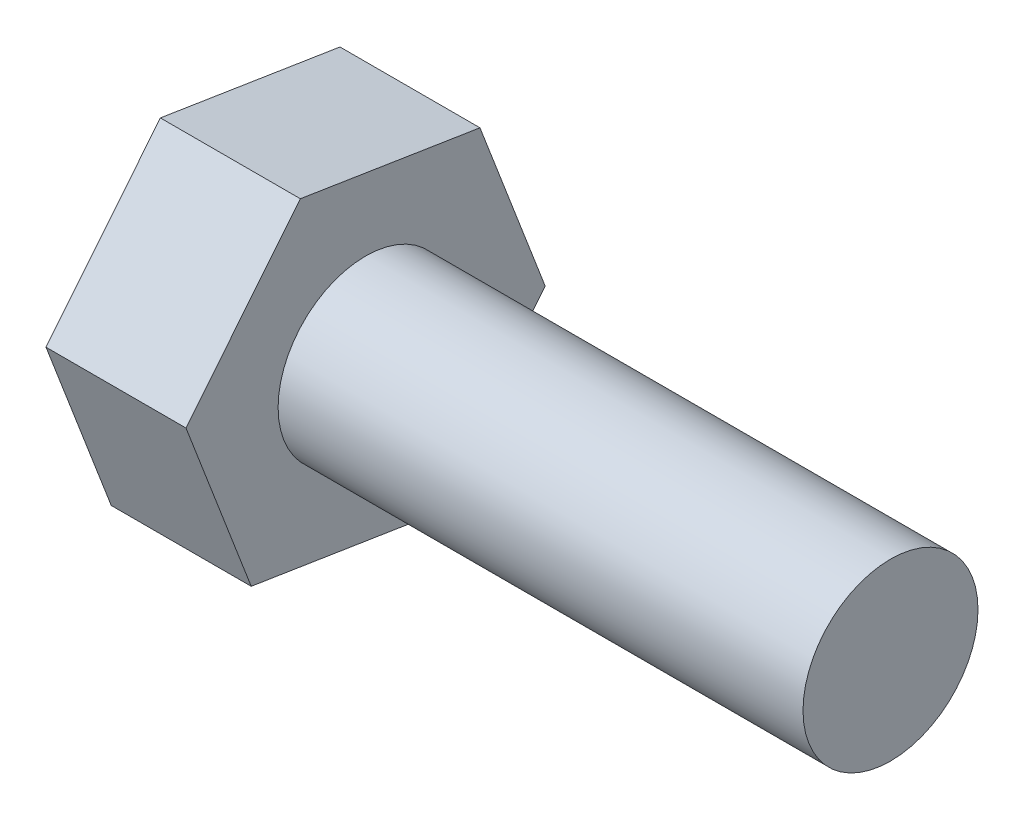
ISO-10303-21;
HEADER;
FILE_DESCRIPTION(('STEP AP214'),'2;1');
FILE_NAME('part.step','',(''),(''),'','','');
FILE_SCHEMA(('AUTOMOTIVE_DESIGN { 1 0 10303 214 1 1 1 1 }'));
ENDSEC;
DATA;
#1=APPLICATION_CONTEXT('core data for automotive mechanical design processes');
#2=APPLICATION_PROTOCOL_DEFINITION('international standard','automotive_design',2000,#1);
#3=PRODUCT_CONTEXT('',#1,'mechanical');
#4=PRODUCT('Part','Part','',(#3));
#5=PRODUCT_RELATED_PRODUCT_CATEGORY('part','',(#4));
#6=PRODUCT_DEFINITION_FORMATION('','',#4);
#7=PRODUCT_DEFINITION_CONTEXT('part definition',#1,'design');
#8=PRODUCT_DEFINITION('design','',#6,#7);
#9=PRODUCT_DEFINITION_SHAPE('','',#8);
#10=(LENGTH_UNIT() NAMED_UNIT(*) SI_UNIT(.MILLI.,.METRE.));
#11=(NAMED_UNIT(*) PLANE_ANGLE_UNIT() SI_UNIT($,.RADIAN.));
#12=(NAMED_UNIT(*) SI_UNIT($,.STERADIAN.) SOLID_ANGLE_UNIT());
#13=UNCERTAINTY_MEASURE_WITH_UNIT(LENGTH_MEASURE(1.E-05),#10,'distance_accuracy_value','');
#14=(GEOMETRIC_REPRESENTATION_CONTEXT(3) GLOBAL_UNCERTAINTY_ASSIGNED_CONTEXT((#13)) GLOBAL_UNIT_ASSIGNED_CONTEXT((#10,
#11,#12)) REPRESENTATION_CONTEXT('',''));
#15=CARTESIAN_POINT('',(0.,0.,0.));
#16=DIRECTION('',(0.,0.,1.));
#17=DIRECTION('',(1.,0.,0.));
#18=AXIS2_PLACEMENT_3D('',#15,#16,#17);
#19=CARTESIAN_POINT('',(30.,0.,0.));
#20=DIRECTION('',(-1.,0.,0.));
#21=DIRECTION('',(0.,0.,1.));
#22=AXIS2_PLACEMENT_3D('',#19,#20,#21);
#23=CYLINDRICAL_SURFACE('',#22,5.);
#24=CARTESIAN_POINT('',(30.,0.,0.));
#25=DIRECTION('',(1.,0.,0.));
#26=DIRECTION('',(0.,0.,-1.));
#27=AXIS2_PLACEMENT_3D('',#24,#25,#26);
#28=CIRCLE('',#27,5.);
#29=CARTESIAN_POINT('',(30.,0.,-5.));
#30=VERTEX_POINT('',#29);
#31=EDGE_CURVE('E11',#30,#30,#28,.T.);
#32=ORIENTED_EDGE('',*,*,#31,.F.);
#33=EDGE_LOOP('',(#32));
#34=FACE_BOUND('',#33,.T.);
#35=CARTESIAN_POINT('',(0.,0.,0.));
#36=DIRECTION('',(-1.,0.,0.));
#37=DIRECTION('',(0.,0.,1.));
#38=AXIS2_PLACEMENT_3D('',#35,#36,#37);
#39=CIRCLE('',#38,5.);
#40=CARTESIAN_POINT('',(0.,0.,5.));
#41=VERTEX_POINT('',#40);
#42=EDGE_CURVE('E40',#41,#41,#39,.T.);
#43=ORIENTED_EDGE('',*,*,#42,.F.);
#44=EDGE_LOOP('',(#43));
#45=FACE_BOUND('',#44,.T.);
#46=ADVANCED_FACE('F32',(#34,#45),#23,.T.);
#47=CARTESIAN_POINT('',(30.,0.,0.));
#48=DIRECTION('',(1.,0.,0.));
#49=DIRECTION('',(0.,0.,-1.));
#50=AXIS2_PLACEMENT_3D('',#47,#48,#49);
#51=PLANE('',#50);
#52=ORIENTED_EDGE('',*,*,#31,.T.);
#53=EDGE_LOOP('',(#52));
#54=FACE_BOUND('',#53,.T.);
#55=ADVANCED_FACE('F141',(#54),#51,.T.);
#56=CARTESIAN_POINT('',(0.,1.62068495230945,10.2651536902941));
#57=DIRECTION('',(-1.,0.,0.));
#58=DIRECTION('',(0.,0.,1.));
#59=AXIS2_PLACEMENT_3D('',#56,#57,#58);
#60=PLANE('',#59);
#61=DIRECTION('',(0.,0.933404715315125,0.358825357837891));
#62=VECTOR('',#61,1.);
#63=CARTESIAN_POINT('',(0.,-8.07954139339151,6.53613118537819));
#64=LINE('',#63,#62);
#65=CARTESIAN_POINT('',(0.,-8.07954139339151,6.53613118537819));
#66=VERTEX_POINT('',#65);
#67=CARTESIAN_POINT('',(0.,1.62068495230945,10.2651536902941));
#68=VERTEX_POINT('',#67);
#69=EDGE_CURVE('E117',#66,#68,#64,.T.);
#70=ORIENTED_EDGE('',*,*,#69,.F.);
#71=DIRECTION('',(0.,0.155950482247906,0.987764874394026));
#72=VECTOR('',#71,1.);
#73=CARTESIAN_POINT('',(0.,-9.70022634570096,-3.72902250491587));
#74=LINE('',#73,#72);
#75=CARTESIAN_POINT('',(0.,-9.70022634570096,-3.72902250491587));
#76=VERTEX_POINT('',#75);
#77=EDGE_CURVE('E77',#76,#66,#74,.T.);
#78=ORIENTED_EDGE('',*,*,#77,.F.);
#79=DIRECTION('',(0.,-0.777454233067218,0.628939516556134));
#80=VECTOR('',#79,1.);
#81=CARTESIAN_POINT('',(0.,-1.62068495230945,-10.2651536902941));
#82=LINE('',#81,#80);
#83=CARTESIAN_POINT('',(0.,-1.62068495230945,-10.2651536902941));
#84=VERTEX_POINT('',#83);
#85=EDGE_CURVE('E71',#84,#76,#82,.T.);
#86=ORIENTED_EDGE('',*,*,#85,.F.);
#87=DIRECTION('',(0.,-0.933404715315125,-0.358825357837892));
#88=VECTOR('',#87,1.);
#89=CARTESIAN_POINT('',(0.,8.07954139339151,-6.53613118537818));
#90=LINE('',#89,#88);
#91=CARTESIAN_POINT('',(0.,8.07954139339151,-6.53613118537818));
#92=VERTEX_POINT('',#91);
#93=EDGE_CURVE('E107',#92,#84,#90,.T.);
#94=ORIENTED_EDGE('',*,*,#93,.F.);
#95=DIRECTION('',(0.,-0.155950482247906,-0.987764874394026));
#96=VECTOR('',#95,1.);
#97=CARTESIAN_POINT('',(0.,9.70022634570096,3.72902250491587));
#98=LINE('',#97,#96);
#99=CARTESIAN_POINT('',(0.,9.70022634570096,3.72902250491587));
#100=VERTEX_POINT('',#99);
#101=EDGE_CURVE('E122',#100,#92,#98,.T.);
#102=ORIENTED_EDGE('',*,*,#101,.F.);
#103=DIRECTION('',(0.,0.777454233067218,-0.628939516556134));
#104=VECTOR('',#103,1.);
#105=CARTESIAN_POINT('',(0.,1.62068495230945,10.2651536902941));
#106=LINE('',#105,#104);
#107=EDGE_CURVE('E120',#68,#100,#106,.T.);
#108=ORIENTED_EDGE('',*,*,#107,.F.);
#109=EDGE_LOOP('',(#70,#78,#86,#94,#102,#108));
#110=FACE_BOUND('',#109,.T.);
#111=ORIENTED_EDGE('',*,*,#42,.T.);
#112=EDGE_LOOP('',(#111));
#113=FACE_BOUND('',#112,.T.);
#114=ADVANCED_FACE('F138',(#110,#113),#60,.F.);
#115=CARTESIAN_POINT('',(-8.,-8.07954139339151,6.53613118537819));
#116=DIRECTION('',(0.,0.358825357837891,-0.933404715315125));
#117=DIRECTION('',(0.,0.933404715315125,0.358825357837892));
#118=AXIS2_PLACEMENT_3D('',#115,#116,#117);
#119=PLANE('',#118);
#120=ORIENTED_EDGE('',*,*,#69,.T.);
#121=DIRECTION('',(1.,0.,0.));
#122=VECTOR('',#121,1.);
#123=CARTESIAN_POINT('',(-8.,1.62068495230945,10.2651536902941));
#124=LINE('',#123,#122);
#125=CARTESIAN_POINT('',(-8.,1.62068495230945,10.2651536902941));
#126=VERTEX_POINT('',#125);
#127=EDGE_CURVE('E134',#126,#68,#124,.T.);
#128=ORIENTED_EDGE('',*,*,#127,.F.);
#129=DIRECTION('',(0.,0.933404715315125,0.358825357837891));
#130=VECTOR('',#129,1.);
#131=CARTESIAN_POINT('',(-8.,-8.07954139339151,6.53613118537819));
#132=LINE('',#131,#130);
#133=CARTESIAN_POINT('',(-8.,-8.07954139339151,6.53613118537819));
#134=VERTEX_POINT('',#133);
#135=EDGE_CURVE('E127',#134,#126,#132,.T.);
#136=ORIENTED_EDGE('',*,*,#135,.F.);
#137=DIRECTION('',(1.,0.,0.));
#138=VECTOR('',#137,1.);
#139=CARTESIAN_POINT('',(-8.,-8.07954139339151,6.53613118537819));
#140=LINE('',#139,#138);
#141=EDGE_CURVE('E113',#134,#66,#140,.T.);
#142=ORIENTED_EDGE('',*,*,#141,.T.);
#143=EDGE_LOOP('',(#120,#128,#136,#142));
#144=FACE_BOUND('',#143,.T.);
#145=ADVANCED_FACE('F151',(#144),#119,.F.);
#146=CARTESIAN_POINT('',(-8.,1.62068495230945,10.2651536902941));
#147=DIRECTION('',(0.,-0.628939516556134,-0.777454233067219));
#148=DIRECTION('',(0.,0.777454233067219,-0.628939516556134));
#149=AXIS2_PLACEMENT_3D('',#146,#147,#148);
#150=PLANE('',#149);
#151=ORIENTED_EDGE('',*,*,#107,.T.);
#152=DIRECTION('',(1.,0.,0.));
#153=VECTOR('',#152,1.);
#154=CARTESIAN_POINT('',(-8.,9.70022634570096,3.72902250491587));
#155=LINE('',#154,#153);
#156=CARTESIAN_POINT('',(-8.,9.70022634570096,3.72902250491587));
#157=VERTEX_POINT('',#156);
#158=EDGE_CURVE('E131',#157,#100,#155,.T.);
#159=ORIENTED_EDGE('',*,*,#158,.F.);
#160=DIRECTION('',(0.,0.777454233067218,-0.628939516556134));
#161=VECTOR('',#160,1.);
#162=CARTESIAN_POINT('',(-8.,1.62068495230945,10.2651536902941));
#163=LINE('',#162,#161);
#164=EDGE_CURVE('E86',#126,#157,#163,.T.);
#165=ORIENTED_EDGE('',*,*,#164,.F.);
#166=ORIENTED_EDGE('',*,*,#127,.T.);
#167=EDGE_LOOP('',(#151,#159,#165,#166));
#168=FACE_BOUND('',#167,.T.);
#169=ADVANCED_FACE('F157',(#168),#150,.F.);
#170=CARTESIAN_POINT('',(-8.,9.70022634570096,3.72902250491587));
#171=DIRECTION('',(0.,-0.987764874394026,0.155950482247906));
#172=DIRECTION('',(0.,-0.155950482247906,-0.987764874394026));
#173=AXIS2_PLACEMENT_3D('',#170,#171,#172);
#174=PLANE('',#173);
#175=ORIENTED_EDGE('',*,*,#101,.T.);
#176=DIRECTION('',(1.,0.,0.));
#177=VECTOR('',#176,1.);
#178=CARTESIAN_POINT('',(-8.,8.07954139339151,-6.53613118537818));
#179=LINE('',#178,#177);
#180=CARTESIAN_POINT('',(-8.,8.07954139339151,-6.53613118537818));
#181=VERTEX_POINT('',#180);
#182=EDGE_CURVE('E108',#181,#92,#179,.T.);
#183=ORIENTED_EDGE('',*,*,#182,.F.);
#184=DIRECTION('',(0.,-0.155950482247906,-0.987764874394026));
#185=VECTOR('',#184,1.);
#186=CARTESIAN_POINT('',(-8.,9.70022634570096,3.72902250491587));
#187=LINE('',#186,#185);
#188=EDGE_CURVE('E99',#157,#181,#187,.T.);
#189=ORIENTED_EDGE('',*,*,#188,.F.);
#190=ORIENTED_EDGE('',*,*,#158,.T.);
#191=EDGE_LOOP('',(#175,#183,#189,#190));
#192=FACE_BOUND('',#191,.T.);
#193=ADVANCED_FACE('F161',(#192),#174,.F.);
#194=CARTESIAN_POINT('',(-8.,8.07954139339151,-6.53613118537818));
#195=DIRECTION('',(0.,-0.358825357837892,0.933404715315125));
#196=DIRECTION('',(0.,-0.933404715315125,-0.358825357837892));
#197=AXIS2_PLACEMENT_3D('',#194,#195,#196);
#198=PLANE('',#197);
#199=ORIENTED_EDGE('',*,*,#93,.T.);
#200=DIRECTION('',(1.,0.,0.));
#201=VECTOR('',#200,1.);
#202=CARTESIAN_POINT('',(-8.,-1.62068495230945,-10.2651536902941));
#203=LINE('',#202,#201);
#204=CARTESIAN_POINT('',(-8.,-1.62068495230945,-10.2651536902941));
#205=VERTEX_POINT('',#204);
#206=EDGE_CURVE('E104',#205,#84,#203,.T.);
#207=ORIENTED_EDGE('',*,*,#206,.F.);
#208=DIRECTION('',(0.,-0.933404715315125,-0.358825357837892));
#209=VECTOR('',#208,1.);
#210=CARTESIAN_POINT('',(-8.,8.07954139339151,-6.53613118537818));
#211=LINE('',#210,#209);
#212=EDGE_CURVE('E93',#181,#205,#211,.T.);
#213=ORIENTED_EDGE('',*,*,#212,.F.);
#214=ORIENTED_EDGE('',*,*,#182,.T.);
#215=EDGE_LOOP('',(#199,#207,#213,#214));
#216=FACE_BOUND('',#215,.T.);
#217=ADVANCED_FACE('F105',(#216),#198,.F.);
#218=CARTESIAN_POINT('',(-8.,-1.62068495230945,-10.2651536902941));
#219=DIRECTION('',(0.,0.628939516556134,0.777454233067218));
#220=DIRECTION('',(0.,-0.777454233067218,0.628939516556134));
#221=AXIS2_PLACEMENT_3D('',#218,#219,#220);
#222=PLANE('',#221);
#223=ORIENTED_EDGE('',*,*,#85,.T.);
#224=DIRECTION('',(1.,0.,0.));
#225=VECTOR('',#224,1.);
#226=CARTESIAN_POINT('',(-8.,-9.70022634570096,-3.72902250491587));
#227=LINE('',#226,#225);
#228=CARTESIAN_POINT('',(-8.,-9.70022634570096,-3.72902250491587));
#229=VERTEX_POINT('',#228);
#230=EDGE_CURVE('E109',#229,#76,#227,.T.);
#231=ORIENTED_EDGE('',*,*,#230,.F.);
#232=DIRECTION('',(0.,-0.777454233067218,0.628939516556134));
#233=VECTOR('',#232,1.);
#234=CARTESIAN_POINT('',(-8.,-1.62068495230945,-10.2651536902941));
#235=LINE('',#234,#233);
#236=EDGE_CURVE('E97',#205,#229,#235,.T.);
#237=ORIENTED_EDGE('',*,*,#236,.F.);
#238=ORIENTED_EDGE('',*,*,#206,.T.);
#239=EDGE_LOOP('',(#223,#231,#237,#238));
#240=FACE_BOUND('',#239,.T.);
#241=ADVANCED_FACE('F111',(#240),#222,.F.);
#242=CARTESIAN_POINT('',(-8.,-9.70022634570096,-3.72902250491587));
#243=DIRECTION('',(0.,0.987764874394026,-0.155950482247906));
#244=DIRECTION('',(0.,0.155950482247906,0.987764874394026));
#245=AXIS2_PLACEMENT_3D('',#242,#243,#244);
#246=PLANE('',#245);
#247=ORIENTED_EDGE('',*,*,#77,.T.);
#248=ORIENTED_EDGE('',*,*,#141,.F.);
#249=DIRECTION('',(0.,0.155950482247906,0.987764874394026));
#250=VECTOR('',#249,1.);
#251=CARTESIAN_POINT('',(-8.,-9.70022634570096,-3.72902250491587));
#252=LINE('',#251,#250);
#253=EDGE_CURVE('E48',#229,#134,#252,.T.);
#254=ORIENTED_EDGE('',*,*,#253,.F.);
#255=ORIENTED_EDGE('',*,*,#230,.T.);
#256=EDGE_LOOP('',(#247,#248,#254,#255));
#257=FACE_BOUND('',#256,.T.);
#258=ADVANCED_FACE('F169',(#257),#246,.F.);
#259=CARTESIAN_POINT('',(-8.,1.62068495230945,10.2651536902941));
#260=DIRECTION('',(-1.,0.,0.));
#261=DIRECTION('',(0.,0.,1.));
#262=AXIS2_PLACEMENT_3D('',#259,#260,#261);
#263=PLANE('',#262);
#264=ORIENTED_EDGE('',*,*,#135,.T.);
#265=ORIENTED_EDGE('',*,*,#164,.T.);
#266=ORIENTED_EDGE('',*,*,#188,.T.);
#267=ORIENTED_EDGE('',*,*,#212,.T.);
#268=ORIENTED_EDGE('',*,*,#236,.T.);
#269=ORIENTED_EDGE('',*,*,#253,.T.);
#270=EDGE_LOOP('',(#264,#265,#266,#267,#268,#269));
#271=FACE_BOUND('',#270,.T.);
#272=ADVANCED_FACE('F95',(#271),#263,.T.);
#273=CLOSED_SHELL('',(#46,#55,#114,#145,#169,#193,#217,#241,#258,#272));
#274=MANIFOLD_SOLID_BREP('B2',#273);
#275=ADVANCED_BREP_SHAPE_REPRESENTATION('',(#18,#274),#14);
#276=SHAPE_DEFINITION_REPRESENTATION(#9,#275);
ENDSEC;
END-ISO-10303-21;
